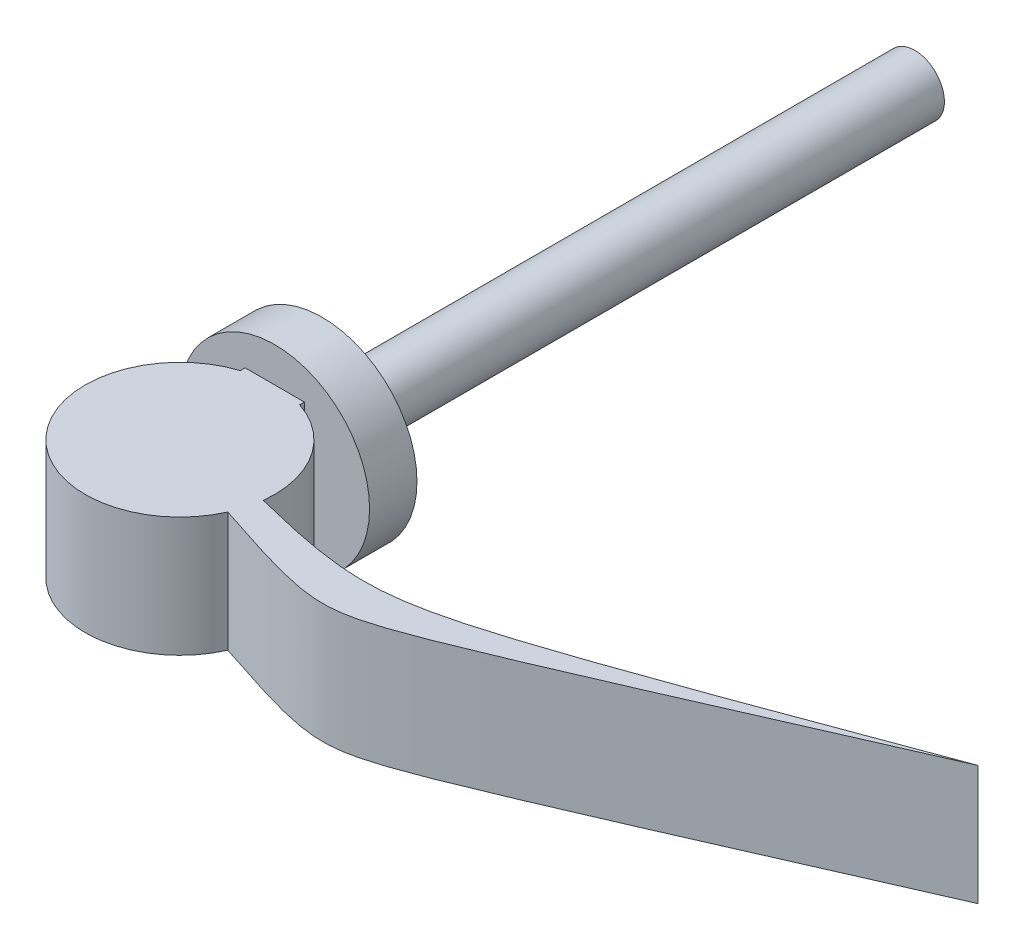
ISO-10303-21;
HEADER;
FILE_DESCRIPTION(('STEP AP214'),'2;1');
FILE_NAME('part.step','',(''),(''),'','','');
FILE_SCHEMA(('AUTOMOTIVE_DESIGN { 1 0 10303 214 1 1 1 1 }'));
ENDSEC;
DATA;
#1=APPLICATION_CONTEXT('core data for automotive mechanical design processes');
#2=APPLICATION_PROTOCOL_DEFINITION('international standard','automotive_design',2000,#1);
#3=PRODUCT_CONTEXT('',#1,'mechanical');
#4=PRODUCT('Part','Part','',(#3));
#5=PRODUCT_RELATED_PRODUCT_CATEGORY('part','',(#4));
#6=PRODUCT_DEFINITION_FORMATION('','',#4);
#7=PRODUCT_DEFINITION_CONTEXT('part definition',#1,'design');
#8=PRODUCT_DEFINITION('design','',#6,#7);
#9=PRODUCT_DEFINITION_SHAPE('','',#8);
#10=(LENGTH_UNIT() NAMED_UNIT(*) SI_UNIT(.MILLI.,.METRE.));
#11=(NAMED_UNIT(*) PLANE_ANGLE_UNIT() SI_UNIT($,.RADIAN.));
#12=(NAMED_UNIT(*) SI_UNIT($,.STERADIAN.) SOLID_ANGLE_UNIT());
#13=UNCERTAINTY_MEASURE_WITH_UNIT(LENGTH_MEASURE(1.E-05),#10,'distance_accuracy_value','');
#14=(GEOMETRIC_REPRESENTATION_CONTEXT(3) GLOBAL_UNCERTAINTY_ASSIGNED_CONTEXT((#13)) GLOBAL_UNIT_ASSIGNED_CONTEXT((#10,
#11,#12)) REPRESENTATION_CONTEXT('',''));
#15=CARTESIAN_POINT('',(0.,0.,0.));
#16=DIRECTION('',(0.,0.,1.));
#17=DIRECTION('',(1.,0.,0.));
#18=AXIS2_PLACEMENT_3D('',#15,#16,#17);
#19=CARTESIAN_POINT('',(0.,0.,54.));
#20=DIRECTION('',(0.,0.,1.));
#21=DIRECTION('',(1.,0.,0.));
#22=AXIS2_PLACEMENT_3D('',#19,#20,#21);
#23=PLANE('',#22);
#24=CARTESIAN_POINT('',(0.,0.,54.));
#25=DIRECTION('',(0.,0.,1.));
#26=DIRECTION('',(1.,0.,0.));
#27=AXIS2_PLACEMENT_3D('',#24,#25,#26);
#28=CIRCLE('',#27,8.);
#29=CARTESIAN_POINT('',(8.,0.,54.));
#30=VERTEX_POINT('',#29);
#31=EDGE_CURVE('E168',#30,#30,#28,.T.);
#32=ORIENTED_EDGE('',*,*,#31,.T.);
#33=EDGE_LOOP('',(#32));
#34=FACE_BOUND('',#33,.T.);
#35=DIRECTION('',(-1.,0.,0.));
#36=VECTOR('',#35,1.);
#37=CARTESIAN_POINT('',(-2.5,-5.05,54.));
#38=LINE('',#37,#36);
#39=CARTESIAN_POINT('',(2.5,-5.05,54.));
#40=VERTEX_POINT('',#39);
#41=CARTESIAN_POINT('',(-2.5,-5.05,54.));
#42=VERTEX_POINT('',#41);
#43=EDGE_CURVE('E159',#40,#42,#38,.T.);
#44=ORIENTED_EDGE('',*,*,#43,.T.);
#45=DIRECTION('',(0.,1.,0.));
#46=VECTOR('',#45,1.);
#47=CARTESIAN_POINT('',(-2.5,-5.05,54.));
#48=LINE('',#47,#46);
#49=CARTESIAN_POINT('',(-2.5,5.05,54.));
#50=VERTEX_POINT('',#49);
#51=EDGE_CURVE('E162',#42,#50,#48,.T.);
#52=ORIENTED_EDGE('',*,*,#51,.T.);
#53=DIRECTION('',(-1.,0.,0.));
#54=VECTOR('',#53,1.);
#55=CARTESIAN_POINT('',(-2.5,5.05,54.));
#56=LINE('',#55,#54);
#57=CARTESIAN_POINT('',(2.5,5.05,54.));
#58=VERTEX_POINT('',#57);
#59=EDGE_CURVE('E154',#58,#50,#56,.T.);
#60=ORIENTED_EDGE('',*,*,#59,.F.);
#61=DIRECTION('',(0.,1.,0.));
#62=VECTOR('',#61,1.);
#63=CARTESIAN_POINT('',(2.5,-5.05,54.));
#64=LINE('',#63,#62);
#65=EDGE_CURVE('E161',#40,#58,#64,.T.);
#66=ORIENTED_EDGE('',*,*,#65,.F.);
#67=EDGE_LOOP('',(#44,#52,#60,#66));
#68=FACE_BOUND('',#67,.T.);
#69=ADVANCED_FACE('F32',(#34,#68),#23,.T.);
#70=CARTESIAN_POINT('',(0.,0.,50.));
#71=DIRECTION('',(0.,0.,-1.));
#72=DIRECTION('',(-1.,0.,0.));
#73=AXIS2_PLACEMENT_3D('',#70,#71,#72);
#74=CYLINDRICAL_SURFACE('',#73,2.5);
#75=CARTESIAN_POINT('',(0.,0.,50.));
#76=DIRECTION('',(0.,0.,1.));
#77=DIRECTION('',(1.,0.,0.));
#78=AXIS2_PLACEMENT_3D('',#75,#76,#77);
#79=CIRCLE('',#78,2.5);
#80=CARTESIAN_POINT('',(2.5,0.,50.));
#81=VERTEX_POINT('',#80);
#82=EDGE_CURVE('E11',#81,#81,#79,.T.);
#83=ORIENTED_EDGE('',*,*,#82,.F.);
#84=EDGE_LOOP('',(#83));
#85=FACE_BOUND('',#84,.T.);
#86=CARTESIAN_POINT('',(0.,0.,0.));
#87=DIRECTION('',(0.,0.,1.));
#88=DIRECTION('',(1.,0.,0.));
#89=AXIS2_PLACEMENT_3D('',#86,#87,#88);
#90=CIRCLE('',#89,2.5);
#91=CARTESIAN_POINT('',(2.5,0.,0.));
#92=VERTEX_POINT('',#91);
#93=EDGE_CURVE('E36',#92,#92,#90,.T.);
#94=ORIENTED_EDGE('',*,*,#93,.T.);
#95=EDGE_LOOP('',(#94));
#96=FACE_BOUND('',#95,.T.);
#97=ADVANCED_FACE('F34',(#85,#96),#74,.T.);
#98=CARTESIAN_POINT('',(0.,0.,0.));
#99=DIRECTION('',(0.,0.,1.));
#100=DIRECTION('',(1.,0.,0.));
#101=AXIS2_PLACEMENT_3D('',#98,#99,#100);
#102=PLANE('',#101);
#103=ORIENTED_EDGE('',*,*,#93,.F.);
#104=EDGE_LOOP('',(#103));
#105=FACE_BOUND('',#104,.T.);
#106=ADVANCED_FACE('F187',(#105),#102,.F.);
#107=CARTESIAN_POINT('',(0.,0.,54.));
#108=DIRECTION('',(0.,0.,-1.));
#109=DIRECTION('',(-1.,0.,0.));
#110=AXIS2_PLACEMENT_3D('',#107,#108,#109);
#111=CYLINDRICAL_SURFACE('',#110,8.);
#112=ORIENTED_EDGE('',*,*,#31,.F.);
#113=EDGE_LOOP('',(#112));
#114=FACE_BOUND('',#113,.T.);
#115=CARTESIAN_POINT('',(0.,0.,50.));
#116=DIRECTION('',(0.,0.,1.));
#117=DIRECTION('',(1.,0.,0.));
#118=AXIS2_PLACEMENT_3D('',#115,#116,#117);
#119=CIRCLE('',#118,8.);
#120=CARTESIAN_POINT('',(8.,0.,50.));
#121=VERTEX_POINT('',#120);
#122=EDGE_CURVE('E165',#121,#121,#119,.T.);
#123=ORIENTED_EDGE('',*,*,#122,.T.);
#124=EDGE_LOOP('',(#123));
#125=FACE_BOUND('',#124,.T.);
#126=ADVANCED_FACE('F174',(#114,#125),#111,.T.);
#127=CARTESIAN_POINT('',(0.,0.,50.));
#128=DIRECTION('',(0.,0.,1.));
#129=DIRECTION('',(1.,0.,0.));
#130=AXIS2_PLACEMENT_3D('',#127,#128,#129);
#131=PLANE('',#130);
#132=ORIENTED_EDGE('',*,*,#82,.T.);
#133=EDGE_LOOP('',(#132));
#134=FACE_BOUND('',#133,.T.);
#135=ORIENTED_EDGE('',*,*,#122,.F.);
#136=EDGE_LOOP('',(#135));
#137=FACE_BOUND('',#136,.T.);
#138=ADVANCED_FACE('F176',(#134,#137),#131,.F.);
#139=CARTESIAN_POINT('',(-2.5,-5.05,54.));
#140=DIRECTION('',(-1.,0.,0.));
#141=DIRECTION('',(0.,0.,1.));
#142=AXIS2_PLACEMENT_3D('',#139,#140,#141);
#143=PLANE('',#142);
#144=DIRECTION('',(0.,1.,0.));
#145=VECTOR('',#144,1.);
#146=CARTESIAN_POINT('',(-2.5,-72.9100465845506,54.4006579232147));
#147=LINE('',#146,#145);
#148=CARTESIAN_POINT('',(-2.5,5.05,54.4006579232147));
#149=VERTEX_POINT('',#148);
#150=CARTESIAN_POINT('',(-2.5,-5.05,54.4006579232147));
#151=VERTEX_POINT('',#150);
#152=EDGE_CURVE('E148',#149,#151,#147,.F.);
#153=ORIENTED_EDGE('',*,*,#152,.F.);
#154=DIRECTION('',(0.,0.,1.));
#155=VECTOR('',#154,1.);
#156=CARTESIAN_POINT('',(-2.5,5.05,54.));
#157=LINE('',#156,#155);
#158=EDGE_CURVE('E150',#50,#149,#157,.T.);
#159=ORIENTED_EDGE('',*,*,#158,.F.);
#160=ORIENTED_EDGE('',*,*,#51,.F.);
#161=DIRECTION('',(0.,0.,1.));
#162=VECTOR('',#161,1.);
#163=CARTESIAN_POINT('',(-2.5,-5.05,54.));
#164=LINE('',#163,#162);
#165=EDGE_CURVE('E55',#42,#151,#164,.T.);
#166=ORIENTED_EDGE('',*,*,#165,.T.);
#167=EDGE_LOOP('',(#153,#159,#160,#166));
#168=FACE_BOUND('',#167,.T.);
#169=ADVANCED_FACE('F178',(#168),#143,.T.);
#170=CARTESIAN_POINT('',(2.5,-5.05,54.));
#171=DIRECTION('',(1.,0.,0.));
#172=DIRECTION('',(0.,0.,-1.));
#173=AXIS2_PLACEMENT_3D('',#170,#171,#172);
#174=PLANE('',#173);
#175=DIRECTION('',(0.,1.,0.));
#176=VECTOR('',#175,1.);
#177=CARTESIAN_POINT('',(2.5,-72.9100465845506,54.4006579232147));
#178=LINE('',#177,#176);
#179=CARTESIAN_POINT('',(2.5,-5.05,54.4006579232147));
#180=VERTEX_POINT('',#179);
#181=CARTESIAN_POINT('',(2.5,5.05,54.4006579232147));
#182=VERTEX_POINT('',#181);
#183=EDGE_CURVE('E47',#180,#182,#178,.T.);
#184=ORIENTED_EDGE('',*,*,#183,.F.);
#185=DIRECTION('',(0.,0.,-1.));
#186=VECTOR('',#185,1.);
#187=CARTESIAN_POINT('',(2.5,-5.05,54.));
#188=LINE('',#187,#186);
#189=EDGE_CURVE('E157',#180,#40,#188,.T.);
#190=ORIENTED_EDGE('',*,*,#189,.T.);
#191=ORIENTED_EDGE('',*,*,#65,.T.);
#192=DIRECTION('',(0.,0.,-1.));
#193=VECTOR('',#192,1.);
#194=CARTESIAN_POINT('',(2.5,5.05,54.));
#195=LINE('',#194,#193);
#196=EDGE_CURVE('E152',#182,#58,#195,.T.);
#197=ORIENTED_EDGE('',*,*,#196,.F.);
#198=EDGE_LOOP('',(#184,#190,#191,#197));
#199=FACE_BOUND('',#198,.T.);
#200=ADVANCED_FACE('F185',(#199),#174,.T.);
#201=CARTESIAN_POINT('',(0.,-5.05,62.));
#202=DIRECTION('',(0.,1.,0.));
#203=DIRECTION('',(0.,0.,1.));
#204=AXIS2_PLACEMENT_3D('',#201,#202,#203);
#205=PLANE('',#204);
#206=ORIENTED_EDGE('',*,*,#189,.F.);
#207=CARTESIAN_POINT('',(0.,-5.05,62.));
#208=DIRECTION('',(0.,1.,0.));
#209=DIRECTION('',(0.,0.,1.));
#210=AXIS2_PLACEMENT_3D('',#207,#208,#209);
#211=CIRCLE('',#210,8.);
#212=CARTESIAN_POINT('',(7.94731215730761,-5.05000000000004,62.9166403189423));
#213=VERTEX_POINT('',#212);
#214=EDGE_CURVE('E138',#180,#213,#211,.F.);
#215=ORIENTED_EDGE('',*,*,#214,.T.);
#216=CARTESIAN_POINT('',(57.46557269888,-5.05000000000001,52.1325795464194));
#217=CARTESIAN_POINT('',(20.1848955247603,-5.05000000000001,66.0318200381101));
#218=CARTESIAN_POINT('',(7.94731215730761,-5.05000000000001,62.9166403189423));
#219=(BOUNDED_CURVE() B_SPLINE_CURVE(2,(#216,#217,#218),.UNSPECIFIED.,.F.,
.F.) B_SPLINE_CURVE_WITH_KNOTS((3,3),(0.,1.),
.UNSPECIFIED.) CURVE() GEOMETRIC_REPRESENTATION_ITEM() RATIONAL_B_SPLINE_CURVE((1.,
3.14938454984365,1.)) REPRESENTATION_ITEM(''));
#220=CARTESIAN_POINT('',(57.46557269888,-5.05000000000001,52.1325795464194));
#221=VERTEX_POINT('',#220);
#222=EDGE_CURVE('E140',#213,#221,#219,.F.);
#223=ORIENTED_EDGE('',*,*,#222,.T.);
#224=CARTESIAN_POINT('',(7.30315405999399,-5.05000000000003,65.2655689819683));
#225=CARTESIAN_POINT('',(18.8516434490223,-5.05000000000002,69.1321860660792));
#226=CARTESIAN_POINT('',(57.46557269888,-5.05000000000003,52.1325795464194));
#227=(BOUNDED_CURVE() B_SPLINE_CURVE(2,(#224,#225,#226),.UNSPECIFIED.,.F.,
.F.) B_SPLINE_CURVE_WITH_KNOTS((3,3),(0.,1.),
.UNSPECIFIED.) CURVE() GEOMETRIC_REPRESENTATION_ITEM() RATIONAL_B_SPLINE_CURVE((1.,
5.51092010629752,1.)) REPRESENTATION_ITEM(''));
#228=CARTESIAN_POINT('',(7.30315405999399,-5.05,65.2655689819683));
#229=VERTEX_POINT('',#228);
#230=EDGE_CURVE('E99',#221,#229,#227,.F.);
#231=ORIENTED_EDGE('',*,*,#230,.T.);
#232=EDGE_CURVE('E222',#229,#151,#211,.F.);
#233=ORIENTED_EDGE('',*,*,#232,.T.);
#234=ORIENTED_EDGE('',*,*,#165,.F.);
#235=ORIENTED_EDGE('',*,*,#43,.F.);
#236=EDGE_LOOP('',(#206,#215,#223,#231,#233,#234,#235));
#237=FACE_BOUND('',#236,.T.);
#238=ADVANCED_FACE('F201',(#237),#205,.F.);
#239=CARTESIAN_POINT('',(0.,5.05,62.));
#240=DIRECTION('',(0.,1.,0.));
#241=DIRECTION('',(0.,0.,1.));
#242=AXIS2_PLACEMENT_3D('',#239,#240,#241);
#243=PLANE('',#242);
#244=CARTESIAN_POINT('',(0.,5.05,62.));
#245=DIRECTION('',(0.,1.,0.));
#246=DIRECTION('',(0.,0.,1.));
#247=AXIS2_PLACEMENT_3D('',#244,#245,#246);
#248=CIRCLE('',#247,8.);
#249=CARTESIAN_POINT('',(7.94731215730761,5.05,62.9166403189423));
#250=VERTEX_POINT('',#249);
#251=EDGE_CURVE('E103',#250,#182,#248,.T.);
#252=ORIENTED_EDGE('',*,*,#251,.T.);
#253=ORIENTED_EDGE('',*,*,#196,.T.);
#254=ORIENTED_EDGE('',*,*,#59,.T.);
#255=ORIENTED_EDGE('',*,*,#158,.T.);
#256=CARTESIAN_POINT('',(7.30315405999399,5.05,65.2655689819683));
#257=VERTEX_POINT('',#256);
#258=EDGE_CURVE('E112',#149,#257,#248,.T.);
#259=ORIENTED_EDGE('',*,*,#258,.T.);
#260=CARTESIAN_POINT('',(7.30315405999399,5.05,65.2655689819683));
#261=CARTESIAN_POINT('',(18.8516434490223,5.05,69.1321860660792));
#262=CARTESIAN_POINT('',(57.46557269888,5.05,52.1325795464194));
#263=(BOUNDED_CURVE() B_SPLINE_CURVE(2,(#260,#261,#262),.UNSPECIFIED.,.F.,
.F.) B_SPLINE_CURVE_WITH_KNOTS((3,3),(0.,1.),
.UNSPECIFIED.) CURVE() GEOMETRIC_REPRESENTATION_ITEM() RATIONAL_B_SPLINE_CURVE((1.,
5.51092010629752,1.)) REPRESENTATION_ITEM(''));
#264=CARTESIAN_POINT('',(57.46557269888,5.05,52.1325795464194));
#265=VERTEX_POINT('',#264);
#266=EDGE_CURVE('E98',#257,#265,#263,.T.);
#267=ORIENTED_EDGE('',*,*,#266,.T.);
#268=CARTESIAN_POINT('',(57.46557269888,5.05,52.1325795464194));
#269=CARTESIAN_POINT('',(20.1848955247603,5.05,66.0318200381101));
#270=CARTESIAN_POINT('',(7.94731215730761,5.05,62.9166403189423));
#271=(BOUNDED_CURVE() B_SPLINE_CURVE(2,(#268,#269,#270),.UNSPECIFIED.,.F.,
.F.) B_SPLINE_CURVE_WITH_KNOTS((3,3),(0.,1.),
.UNSPECIFIED.) CURVE() GEOMETRIC_REPRESENTATION_ITEM() RATIONAL_B_SPLINE_CURVE((1.,
3.14938454984365,1.)) REPRESENTATION_ITEM(''));
#272=EDGE_CURVE('E106',#265,#250,#271,.T.);
#273=ORIENTED_EDGE('',*,*,#272,.T.);
#274=EDGE_LOOP('',(#252,#253,#254,#255,#259,#267,#273));
#275=FACE_BOUND('',#274,.T.);
#276=ADVANCED_FACE('F114',(#275),#243,.T.);
#277=CARTESIAN_POINT('',(0.,-72.9100465845506,62.));
#278=DIRECTION('',(0.,1.,0.));
#279=DIRECTION('',(0.,0.,1.));
#280=AXIS2_PLACEMENT_3D('',#277,#278,#279);
#281=CYLINDRICAL_SURFACE('',#280,8.);
#282=ORIENTED_EDGE('',*,*,#258,.F.);
#283=ORIENTED_EDGE('',*,*,#152,.T.);
#284=ORIENTED_EDGE('',*,*,#232,.F.);
#285=DIRECTION('',(0.,1.,0.));
#286=VECTOR('',#285,1.);
#287=CARTESIAN_POINT('',(7.30315405999399,-72.9100465845506,65.2655689819683));
#288=LINE('',#287,#286);
#289=EDGE_CURVE('E136',#229,#257,#288,.T.);
#290=ORIENTED_EDGE('',*,*,#289,.T.);
#291=EDGE_LOOP('',(#282,#283,#284,#290));
#292=FACE_BOUND('',#291,.T.);
#293=ADVANCED_FACE('F207',(#292),#281,.T.);
#294=CARTESIAN_POINT('',(7.30315405999399,-72.9100465845506,65.2655689819683));
#295=CARTESIAN_POINT('',(18.8516434490223,-72.9100465845506,69.1321860660792));
#296=CARTESIAN_POINT('',(57.46557269888,-72.9100465845506,52.1325795464194));
#297=(BOUNDED_CURVE() B_SPLINE_CURVE(2,(#294,#295,#296),.UNSPECIFIED.,.F.,
.F.) B_SPLINE_CURVE_WITH_KNOTS((3,3),(0.,1.),
.UNSPECIFIED.) CURVE() GEOMETRIC_REPRESENTATION_ITEM() RATIONAL_B_SPLINE_CURVE((1.,
5.51092010629752,1.)) REPRESENTATION_ITEM(''));
#298=DIRECTION('',(0.,1.,0.));
#299=VECTOR('',#298,1.);
#300=SURFACE_OF_LINEAR_EXTRUSION('',#297,#299);
#301=ORIENTED_EDGE('',*,*,#230,.F.);
#302=DIRECTION('',(0.,1.,0.));
#303=VECTOR('',#302,1.);
#304=CARTESIAN_POINT('',(57.46557269888,-72.9100465845506,52.1325795464194));
#305=LINE('',#304,#303);
#306=EDGE_CURVE('E93',#221,#265,#305,.T.);
#307=ORIENTED_EDGE('',*,*,#306,.T.);
#308=ORIENTED_EDGE('',*,*,#266,.F.);
#309=ORIENTED_EDGE('',*,*,#289,.F.);
#310=EDGE_LOOP('',(#301,#307,#308,#309));
#311=FACE_BOUND('',#310,.T.);
#312=ADVANCED_FACE('F95',(#311),#300,.T.);
#313=ORIENTED_EDGE('',*,*,#214,.F.);
#314=ORIENTED_EDGE('',*,*,#183,.T.);
#315=ORIENTED_EDGE('',*,*,#251,.F.);
#316=DIRECTION('',(0.,1.,0.));
#317=VECTOR('',#316,1.);
#318=CARTESIAN_POINT('',(7.94731215730761,-72.9100465845506,62.9166403189423));
#319=LINE('',#318,#317);
#320=EDGE_CURVE('E102',#213,#250,#319,.T.);
#321=ORIENTED_EDGE('',*,*,#320,.F.);
#322=EDGE_LOOP('',(#313,#314,#315,#321));
#323=FACE_BOUND('',#322,.T.);
#324=ADVANCED_FACE('F210',(#323),#281,.T.);
#325=CARTESIAN_POINT('',(57.46557269888,-72.9100465845506,52.1325795464194));
#326=CARTESIAN_POINT('',(20.1848955247603,-72.9100465845506,66.0318200381101));
#327=CARTESIAN_POINT('',(7.94731215730761,-72.9100465845506,62.9166403189423));
#328=(BOUNDED_CURVE() B_SPLINE_CURVE(2,(#325,#326,#327),.UNSPECIFIED.,.F.,
.F.) B_SPLINE_CURVE_WITH_KNOTS((3,3),(0.,1.),
.UNSPECIFIED.) CURVE() GEOMETRIC_REPRESENTATION_ITEM() RATIONAL_B_SPLINE_CURVE((1.,
3.14938454984365,1.)) REPRESENTATION_ITEM(''));
#329=DIRECTION('',(0.,1.,0.));
#330=VECTOR('',#329,1.);
#331=SURFACE_OF_LINEAR_EXTRUSION('',#328,#330);
#332=ORIENTED_EDGE('',*,*,#222,.F.);
#333=ORIENTED_EDGE('',*,*,#320,.T.);
#334=ORIENTED_EDGE('',*,*,#272,.F.);
#335=ORIENTED_EDGE('',*,*,#306,.F.);
#336=EDGE_LOOP('',(#332,#333,#334,#335));
#337=FACE_BOUND('',#336,.T.);
#338=ADVANCED_FACE('F107',(#337),#331,.T.);
#339=CLOSED_SHELL('',(#69,#97,#106,#126,#138,#169,#200,#238,#276,#293,#312,#324,#338));
#340=MANIFOLD_SOLID_BREP('B2',#339);
#341=ADVANCED_BREP_SHAPE_REPRESENTATION('',(#18,#340),#14);
#342=SHAPE_DEFINITION_REPRESENTATION(#9,#341);
ENDSEC;
END-ISO-10303-21;
